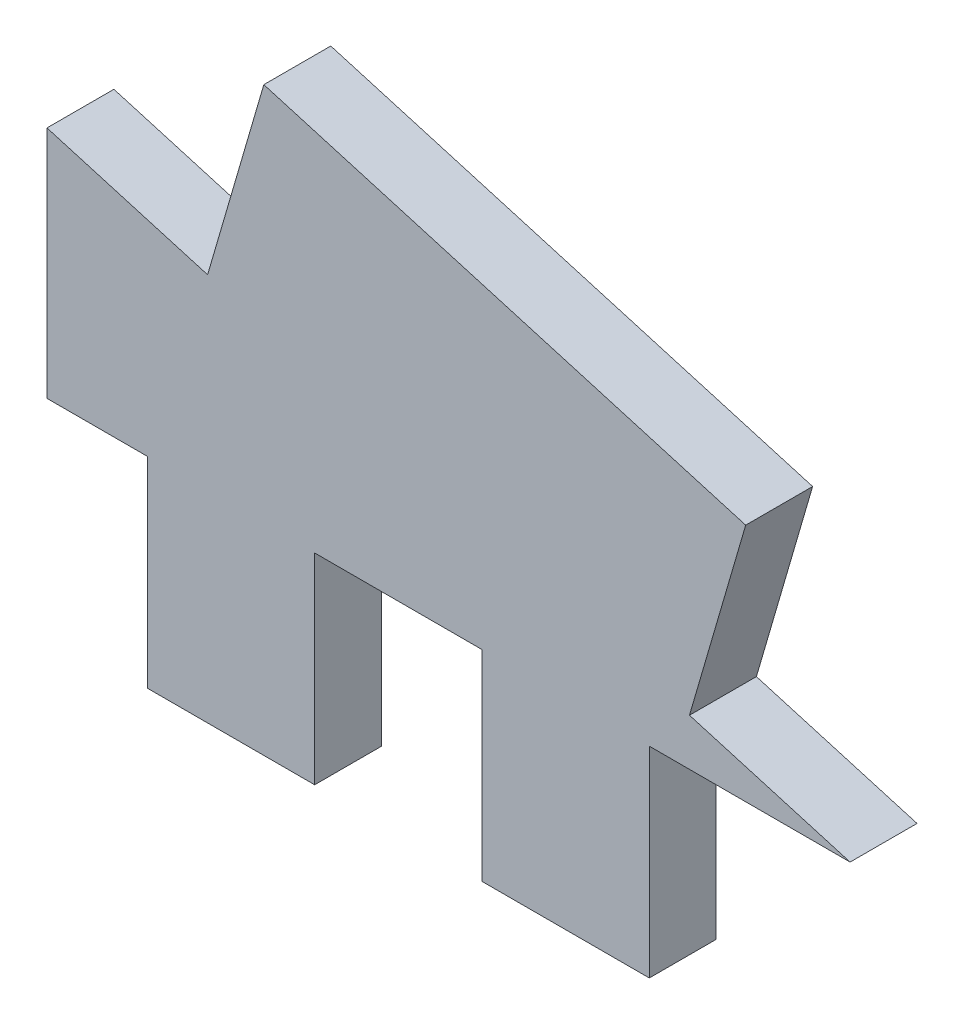
ISO-10303-21;
HEADER;
FILE_DESCRIPTION(('STEP AP214'),'2;1');
FILE_NAME('part.step','',(''),(''),'','','');
FILE_SCHEMA(('AUTOMOTIVE_DESIGN { 1 0 10303 214 1 1 1 1 }'));
ENDSEC;
DATA;
#1=APPLICATION_CONTEXT('core data for automotive mechanical design processes');
#2=APPLICATION_PROTOCOL_DEFINITION('international standard','automotive_design',2000,#1);
#3=PRODUCT_CONTEXT('',#1,'mechanical');
#4=PRODUCT('Part','Part','',(#3));
#5=PRODUCT_RELATED_PRODUCT_CATEGORY('part','',(#4));
#6=PRODUCT_DEFINITION_FORMATION('','',#4);
#7=PRODUCT_DEFINITION_CONTEXT('part definition',#1,'design');
#8=PRODUCT_DEFINITION('design','',#6,#7);
#9=PRODUCT_DEFINITION_SHAPE('','',#8);
#10=(LENGTH_UNIT() NAMED_UNIT(*) SI_UNIT(.MILLI.,.METRE.));
#11=(NAMED_UNIT(*) PLANE_ANGLE_UNIT() SI_UNIT($,.RADIAN.));
#12=(NAMED_UNIT(*) SI_UNIT($,.STERADIAN.) SOLID_ANGLE_UNIT());
#13=UNCERTAINTY_MEASURE_WITH_UNIT(LENGTH_MEASURE(1.E-05),#10,'distance_accuracy_value','');
#14=(GEOMETRIC_REPRESENTATION_CONTEXT(3) GLOBAL_UNCERTAINTY_ASSIGNED_CONTEXT((#13)) GLOBAL_UNIT_ASSIGNED_CONTEXT((#10,
#11,#12)) REPRESENTATION_CONTEXT('',''));
#15=CARTESIAN_POINT('',(0.,0.,0.));
#16=DIRECTION('',(0.,0.,1.));
#17=DIRECTION('',(1.,0.,0.));
#18=AXIS2_PLACEMENT_3D('',#15,#16,#17);
#19=CARTESIAN_POINT('',(1.8816,6.4512,2.));
#20=DIRECTION('',(-0.28,-0.96,0.));
#21=DIRECTION('',(0.96,-0.28,0.));
#22=AXIS2_PLACEMENT_3D('',#19,#20,#21);
#23=PLANE('',#22);
#24=DIRECTION('',(-0.96,0.28,0.));
#25=VECTOR('',#24,1.);
#26=CARTESIAN_POINT('',(1.8816,6.4512,0.));
#27=LINE('',#26,#25);
#28=CARTESIAN_POINT('',(24.,0.,0.));
#29=VERTEX_POINT('',#28);
#30=CARTESIAN_POINT('',(19.2,1.4,0.));
#31=VERTEX_POINT('',#30);
#32=EDGE_CURVE('E176',#29,#31,#27,.T.);
#33=ORIENTED_EDGE('',*,*,#32,.T.);
#34=DIRECTION('',(0.,0.,-1.));
#35=VECTOR('',#34,1.);
#36=CARTESIAN_POINT('',(19.2,1.4,2.));
#37=LINE('',#36,#35);
#38=CARTESIAN_POINT('',(19.2,1.4,2.));
#39=VERTEX_POINT('',#38);
#40=EDGE_CURVE('E11',#39,#31,#37,.T.);
#41=ORIENTED_EDGE('',*,*,#40,.F.);
#42=DIRECTION('',(-0.96,0.28,0.));
#43=VECTOR('',#42,1.);
#44=CARTESIAN_POINT('',(1.8816,6.4512,2.));
#45=LINE('',#44,#43);
#46=CARTESIAN_POINT('',(24.,0.,2.));
#47=VERTEX_POINT('',#46);
#48=EDGE_CURVE('E254',#47,#39,#45,.T.);
#49=ORIENTED_EDGE('',*,*,#48,.F.);
#50=DIRECTION('',(0.,0.,-1.));
#51=VECTOR('',#50,1.);
#52=CARTESIAN_POINT('',(24.,0.,2.));
#53=LINE('',#52,#51);
#54=EDGE_CURVE('E170',#47,#29,#53,.T.);
#55=ORIENTED_EDGE('',*,*,#54,.T.);
#56=EDGE_LOOP('',(#33,#41,#49,#55));
#57=FACE_BOUND('',#56,.T.);
#58=ADVANCED_FACE('F36',(#57),#23,.F.);
#59=CARTESIAN_POINT('',(17.3184,-5.05119999999999,2.));
#60=DIRECTION('',(-0.96,0.28,0.));
#61=DIRECTION('',(-0.28,-0.96,0.));
#62=AXIS2_PLACEMENT_3D('',#59,#60,#61);
#63=PLANE('',#62);
#64=DIRECTION('',(0.28,0.96,0.));
#65=VECTOR('',#64,1.);
#66=CARTESIAN_POINT('',(17.3184,-5.05119999999999,0.));
#67=LINE('',#66,#65);
#68=CARTESIAN_POINT('',(20.88,7.16,0.));
#69=VERTEX_POINT('',#68);
#70=EDGE_CURVE('E179',#31,#69,#67,.T.);
#71=ORIENTED_EDGE('',*,*,#70,.T.);
#72=DIRECTION('',(0.,0.,-1.));
#73=VECTOR('',#72,1.);
#74=CARTESIAN_POINT('',(20.88,7.16,2.));
#75=LINE('',#74,#73);
#76=CARTESIAN_POINT('',(20.88,7.16,2.));
#77=VERTEX_POINT('',#76);
#78=EDGE_CURVE('E45',#77,#69,#75,.T.);
#79=ORIENTED_EDGE('',*,*,#78,.F.);
#80=DIRECTION('',(0.28,0.96,0.));
#81=VECTOR('',#80,1.);
#82=CARTESIAN_POINT('',(17.3184,-5.05119999999999,2.));
#83=LINE('',#82,#81);
#84=EDGE_CURVE('E113',#39,#77,#83,.T.);
#85=ORIENTED_EDGE('',*,*,#84,.F.);
#86=ORIENTED_EDGE('',*,*,#40,.T.);
#87=EDGE_LOOP('',(#71,#79,#85,#86));
#88=FACE_BOUND('',#87,.T.);
#89=ADVANCED_FACE('F38',(#88),#63,.F.);
#90=CARTESIAN_POINT('',(3.5616,12.2112,2.));
#91=DIRECTION('',(0.28,0.96,0.));
#92=DIRECTION('',(-0.96,0.28,0.));
#93=AXIS2_PLACEMENT_3D('',#90,#91,#92);
#94=PLANE('',#93);
#95=DIRECTION('',(0.96,-0.28,0.));
#96=VECTOR('',#95,1.);
#97=CARTESIAN_POINT('',(3.5616,12.2112,0.));
#98=LINE('',#97,#96);
#99=CARTESIAN_POINT('',(6.48,11.36,0.));
#100=VERTEX_POINT('',#99);
#101=EDGE_CURVE('E183',#100,#69,#98,.T.);
#102=ORIENTED_EDGE('',*,*,#101,.F.);
#103=DIRECTION('',(0.,0.,-1.));
#104=VECTOR('',#103,1.);
#105=CARTESIAN_POINT('',(6.48,11.36,2.));
#106=LINE('',#105,#104);
#107=CARTESIAN_POINT('',(6.48,11.36,2.));
#108=VERTEX_POINT('',#107);
#109=EDGE_CURVE('E231',#108,#100,#106,.T.);
#110=ORIENTED_EDGE('',*,*,#109,.F.);
#111=DIRECTION('',(0.96,-0.28,0.));
#112=VECTOR('',#111,1.);
#113=CARTESIAN_POINT('',(3.5616,12.2112,2.));
#114=LINE('',#113,#112);
#115=EDGE_CURVE('E237',#108,#77,#114,.T.);
#116=ORIENTED_EDGE('',*,*,#115,.T.);
#117=ORIENTED_EDGE('',*,*,#78,.T.);
#118=EDGE_LOOP('',(#102,#110,#116,#117));
#119=FACE_BOUND('',#118,.T.);
#120=ADVANCED_FACE('F235',(#119),#94,.T.);
#121=CARTESIAN_POINT('',(2.9184,-0.8512,2.));
#122=DIRECTION('',(-0.96,0.28,0.));
#123=DIRECTION('',(-0.28,-0.96,0.));
#124=AXIS2_PLACEMENT_3D('',#121,#122,#123);
#125=PLANE('',#124);
#126=DIRECTION('',(0.28,0.96,0.));
#127=VECTOR('',#126,1.);
#128=CARTESIAN_POINT('',(2.9184,-0.8512,0.));
#129=LINE('',#128,#127);
#130=CARTESIAN_POINT('',(4.8,5.6,0.));
#131=VERTEX_POINT('',#130);
#132=EDGE_CURVE('E186',#131,#100,#129,.T.);
#133=ORIENTED_EDGE('',*,*,#132,.F.);
#134=DIRECTION('',(0.,0.,-1.));
#135=VECTOR('',#134,1.);
#136=CARTESIAN_POINT('',(4.8,5.6,2.));
#137=LINE('',#136,#135);
#138=CARTESIAN_POINT('',(4.8,5.6,2.));
#139=VERTEX_POINT('',#138);
#140=EDGE_CURVE('E229',#139,#131,#137,.T.);
#141=ORIENTED_EDGE('',*,*,#140,.F.);
#142=DIRECTION('',(0.28,0.96,0.));
#143=VECTOR('',#142,1.);
#144=CARTESIAN_POINT('',(2.9184,-0.8512,2.));
#145=LINE('',#144,#143);
#146=EDGE_CURVE('E250',#139,#108,#145,.T.);
#147=ORIENTED_EDGE('',*,*,#146,.T.);
#148=ORIENTED_EDGE('',*,*,#109,.T.);
#149=EDGE_LOOP('',(#133,#141,#147,#148));
#150=FACE_BOUND('',#149,.T.);
#151=ADVANCED_FACE('F246',(#150),#125,.T.);
#152=CARTESIAN_POINT('',(0.,7.,0.));
#153=VERTEX_POINT('',#152);
#154=EDGE_CURVE('E180',#131,#153,#27,.T.);
#155=ORIENTED_EDGE('',*,*,#154,.T.);
#156=DIRECTION('',(0.,0.,-1.));
#157=VECTOR('',#156,1.);
#158=CARTESIAN_POINT('',(0.,7.,2.));
#159=LINE('',#158,#157);
#160=CARTESIAN_POINT('',(0.,7.,2.));
#161=VERTEX_POINT('',#160);
#162=EDGE_CURVE('E226',#161,#153,#159,.T.);
#163=ORIENTED_EDGE('',*,*,#162,.F.);
#164=EDGE_CURVE('E252',#139,#161,#45,.T.);
#165=ORIENTED_EDGE('',*,*,#164,.F.);
#166=ORIENTED_EDGE('',*,*,#140,.T.);
#167=EDGE_LOOP('',(#155,#163,#165,#166));
#168=FACE_BOUND('',#167,.T.);
#169=ADVANCED_FACE('F280',(#168),#23,.F.);
#170=CARTESIAN_POINT('',(0.,0.,2.));
#171=DIRECTION('',(1.,0.,0.));
#172=DIRECTION('',(0.,1.,0.));
#173=AXIS2_PLACEMENT_3D('',#170,#171,#172);
#174=PLANE('',#173);
#175=DIRECTION('',(0.,-1.,0.));
#176=VECTOR('',#175,1.);
#177=CARTESIAN_POINT('',(0.,0.,0.));
#178=LINE('',#177,#176);
#179=CARTESIAN_POINT('',(0.,0.,0.));
#180=VERTEX_POINT('',#179);
#181=EDGE_CURVE('E189',#153,#180,#178,.T.);
#182=ORIENTED_EDGE('',*,*,#181,.T.);
#183=DIRECTION('',(0.,0.,-1.));
#184=VECTOR('',#183,1.);
#185=CARTESIAN_POINT('',(0.,0.,2.));
#186=LINE('',#185,#184);
#187=CARTESIAN_POINT('',(0.,0.,2.));
#188=VERTEX_POINT('',#187);
#189=EDGE_CURVE('E223',#188,#180,#186,.T.);
#190=ORIENTED_EDGE('',*,*,#189,.F.);
#191=DIRECTION('',(0.,-1.,0.));
#192=VECTOR('',#191,1.);
#193=CARTESIAN_POINT('',(0.,0.,2.));
#194=LINE('',#193,#192);
#195=EDGE_CURVE('E258',#161,#188,#194,.T.);
#196=ORIENTED_EDGE('',*,*,#195,.F.);
#197=ORIENTED_EDGE('',*,*,#162,.T.);
#198=EDGE_LOOP('',(#182,#190,#196,#197));
#199=FACE_BOUND('',#198,.T.);
#200=ADVANCED_FACE('F282',(#199),#174,.F.);
#201=CARTESIAN_POINT('',(0.,0.,2.));
#202=DIRECTION('',(0.,1.,0.));
#203=DIRECTION('',(0.,0.,1.));
#204=AXIS2_PLACEMENT_3D('',#201,#202,#203);
#205=PLANE('',#204);
#206=DIRECTION('',(1.,0.,0.));
#207=VECTOR('',#206,1.);
#208=CARTESIAN_POINT('',(0.,0.,0.));
#209=LINE('',#208,#207);
#210=CARTESIAN_POINT('',(3.,0.,0.));
#211=VERTEX_POINT('',#210);
#212=EDGE_CURVE('E191',#180,#211,#209,.T.);
#213=ORIENTED_EDGE('',*,*,#212,.T.);
#214=DIRECTION('',(0.,0.,-1.));
#215=VECTOR('',#214,1.);
#216=CARTESIAN_POINT('',(3.,0.,2.));
#217=LINE('',#216,#215);
#218=CARTESIAN_POINT('',(3.,0.,2.));
#219=VERTEX_POINT('',#218);
#220=EDGE_CURVE('E220',#219,#211,#217,.T.);
#221=ORIENTED_EDGE('',*,*,#220,.F.);
#222=DIRECTION('',(1.,0.,0.));
#223=VECTOR('',#222,1.);
#224=CARTESIAN_POINT('',(0.,0.,2.));
#225=LINE('',#224,#223);
#226=EDGE_CURVE('E173',#188,#219,#225,.T.);
#227=ORIENTED_EDGE('',*,*,#226,.F.);
#228=ORIENTED_EDGE('',*,*,#189,.T.);
#229=EDGE_LOOP('',(#213,#221,#227,#228));
#230=FACE_BOUND('',#229,.T.);
#231=ADVANCED_FACE('F287',(#230),#205,.F.);
#232=CARTESIAN_POINT('',(3.,0.,2.));
#233=DIRECTION('',(1.,0.,0.));
#234=DIRECTION('',(0.,1.,0.));
#235=AXIS2_PLACEMENT_3D('',#232,#233,#234);
#236=PLANE('',#235);
#237=DIRECTION('',(0.,-1.,0.));
#238=VECTOR('',#237,1.);
#239=CARTESIAN_POINT('',(3.,0.,0.));
#240=LINE('',#239,#238);
#241=CARTESIAN_POINT('',(3.,-6.,0.));
#242=VERTEX_POINT('',#241);
#243=EDGE_CURVE('E193',#211,#242,#240,.T.);
#244=ORIENTED_EDGE('',*,*,#243,.T.);
#245=DIRECTION('',(0.,0.,-1.));
#246=VECTOR('',#245,1.);
#247=CARTESIAN_POINT('',(3.,-6.,2.));
#248=LINE('',#247,#246);
#249=CARTESIAN_POINT('',(3.,-6.,2.));
#250=VERTEX_POINT('',#249);
#251=EDGE_CURVE('E217',#250,#242,#248,.T.);
#252=ORIENTED_EDGE('',*,*,#251,.F.);
#253=DIRECTION('',(0.,-1.,0.));
#254=VECTOR('',#253,1.);
#255=CARTESIAN_POINT('',(3.,0.,2.));
#256=LINE('',#255,#254);
#257=EDGE_CURVE('E260',#219,#250,#256,.T.);
#258=ORIENTED_EDGE('',*,*,#257,.F.);
#259=ORIENTED_EDGE('',*,*,#220,.T.);
#260=EDGE_LOOP('',(#244,#252,#258,#259));
#261=FACE_BOUND('',#260,.T.);
#262=ADVANCED_FACE('F293',(#261),#236,.F.);
#263=CARTESIAN_POINT('',(0.,-6.,2.));
#264=DIRECTION('',(0.,1.,0.));
#265=DIRECTION('',(0.,0.,1.));
#266=AXIS2_PLACEMENT_3D('',#263,#264,#265);
#267=PLANE('',#266);
#268=DIRECTION('',(1.,0.,0.));
#269=VECTOR('',#268,1.);
#270=CARTESIAN_POINT('',(0.,-6.,0.));
#271=LINE('',#270,#269);
#272=CARTESIAN_POINT('',(8.,-6.,0.));
#273=VERTEX_POINT('',#272);
#274=EDGE_CURVE('E196',#242,#273,#271,.T.);
#275=ORIENTED_EDGE('',*,*,#274,.T.);
#276=DIRECTION('',(0.,0.,-1.));
#277=VECTOR('',#276,1.);
#278=CARTESIAN_POINT('',(8.,-6.,2.));
#279=LINE('',#278,#277);
#280=CARTESIAN_POINT('',(8.,-6.,2.));
#281=VERTEX_POINT('',#280);
#282=EDGE_CURVE('E215',#281,#273,#279,.T.);
#283=ORIENTED_EDGE('',*,*,#282,.F.);
#284=DIRECTION('',(1.,0.,0.));
#285=VECTOR('',#284,1.);
#286=CARTESIAN_POINT('',(0.,-6.,2.));
#287=LINE('',#286,#285);
#288=EDGE_CURVE('E262',#250,#281,#287,.T.);
#289=ORIENTED_EDGE('',*,*,#288,.F.);
#290=ORIENTED_EDGE('',*,*,#251,.T.);
#291=EDGE_LOOP('',(#275,#283,#289,#290));
#292=FACE_BOUND('',#291,.T.);
#293=ADVANCED_FACE('F297',(#292),#267,.F.);
#294=CARTESIAN_POINT('',(8.,0.,2.));
#295=DIRECTION('',(1.,0.,0.));
#296=DIRECTION('',(0.,0.,-1.));
#297=AXIS2_PLACEMENT_3D('',#294,#295,#296);
#298=PLANE('',#297);
#299=DIRECTION('',(0.,-1.,0.));
#300=VECTOR('',#299,1.);
#301=CARTESIAN_POINT('',(8.,0.,0.));
#302=LINE('',#301,#300);
#303=CARTESIAN_POINT('',(8.,0.,0.));
#304=VERTEX_POINT('',#303);
#305=EDGE_CURVE('E199',#304,#273,#302,.T.);
#306=ORIENTED_EDGE('',*,*,#305,.F.);
#307=DIRECTION('',(0.,0.,-1.));
#308=VECTOR('',#307,1.);
#309=CARTESIAN_POINT('',(8.,0.,2.));
#310=LINE('',#309,#308);
#311=CARTESIAN_POINT('',(8.,0.,2.));
#312=VERTEX_POINT('',#311);
#313=EDGE_CURVE('E213',#312,#304,#310,.T.);
#314=ORIENTED_EDGE('',*,*,#313,.F.);
#315=DIRECTION('',(0.,-1.,0.));
#316=VECTOR('',#315,1.);
#317=CARTESIAN_POINT('',(8.,0.,2.));
#318=LINE('',#317,#316);
#319=EDGE_CURVE('E264',#312,#281,#318,.T.);
#320=ORIENTED_EDGE('',*,*,#319,.T.);
#321=ORIENTED_EDGE('',*,*,#282,.T.);
#322=EDGE_LOOP('',(#306,#314,#320,#321));
#323=FACE_BOUND('',#322,.T.);
#324=ADVANCED_FACE('F300',(#323),#298,.T.);
#325=CARTESIAN_POINT('',(13.,0.,0.));
#326=VERTEX_POINT('',#325);
#327=EDGE_CURVE('E194',#304,#326,#209,.T.);
#328=ORIENTED_EDGE('',*,*,#327,.T.);
#329=DIRECTION('',(0.,0.,-1.));
#330=VECTOR('',#329,1.);
#331=CARTESIAN_POINT('',(13.,0.,2.));
#332=LINE('',#331,#330);
#333=CARTESIAN_POINT('',(13.,0.,2.));
#334=VERTEX_POINT('',#333);
#335=EDGE_CURVE('E210',#334,#326,#332,.T.);
#336=ORIENTED_EDGE('',*,*,#335,.F.);
#337=EDGE_CURVE('E172',#312,#334,#225,.T.);
#338=ORIENTED_EDGE('',*,*,#337,.F.);
#339=ORIENTED_EDGE('',*,*,#313,.T.);
#340=EDGE_LOOP('',(#328,#336,#338,#339));
#341=FACE_BOUND('',#340,.T.);
#342=ADVANCED_FACE('F270',(#341),#205,.F.);
#343=CARTESIAN_POINT('',(13.,0.,2.));
#344=DIRECTION('',(1.,0.,0.));
#345=DIRECTION('',(0.,0.,-1.));
#346=AXIS2_PLACEMENT_3D('',#343,#344,#345);
#347=PLANE('',#346);
#348=DIRECTION('',(0.,-1.,0.));
#349=VECTOR('',#348,1.);
#350=CARTESIAN_POINT('',(13.,0.,0.));
#351=LINE('',#350,#349);
#352=CARTESIAN_POINT('',(13.,-6.,0.));
#353=VERTEX_POINT('',#352);
#354=EDGE_CURVE('E202',#326,#353,#351,.T.);
#355=ORIENTED_EDGE('',*,*,#354,.T.);
#356=DIRECTION('',(0.,0.,-1.));
#357=VECTOR('',#356,1.);
#358=CARTESIAN_POINT('',(13.,-6.,2.));
#359=LINE('',#358,#357);
#360=CARTESIAN_POINT('',(13.,-6.,2.));
#361=VERTEX_POINT('',#360);
#362=EDGE_CURVE('E166',#361,#353,#359,.T.);
#363=ORIENTED_EDGE('',*,*,#362,.F.);
#364=DIRECTION('',(0.,-1.,0.));
#365=VECTOR('',#364,1.);
#366=CARTESIAN_POINT('',(13.,0.,2.));
#367=LINE('',#366,#365);
#368=EDGE_CURVE('E153',#334,#361,#367,.T.);
#369=ORIENTED_EDGE('',*,*,#368,.F.);
#370=ORIENTED_EDGE('',*,*,#335,.T.);
#371=EDGE_LOOP('',(#355,#363,#369,#370));
#372=FACE_BOUND('',#371,.T.);
#373=ADVANCED_FACE('F274',(#372),#347,.F.);
#374=CARTESIAN_POINT('',(0.,-6.,2.));
#375=DIRECTION('',(0.,1.,0.));
#376=DIRECTION('',(0.,0.,1.));
#377=AXIS2_PLACEMENT_3D('',#374,#375,#376);
#378=PLANE('',#377);
#379=DIRECTION('',(1.,0.,0.));
#380=VECTOR('',#379,1.);
#381=CARTESIAN_POINT('',(0.,-6.,0.));
#382=LINE('',#381,#380);
#383=CARTESIAN_POINT('',(18.,-6.,0.));
#384=VERTEX_POINT('',#383);
#385=EDGE_CURVE('E162',#353,#384,#382,.T.);
#386=ORIENTED_EDGE('',*,*,#385,.T.);
#387=DIRECTION('',(0.,0.,-1.));
#388=VECTOR('',#387,1.);
#389=CARTESIAN_POINT('',(18.,-6.,2.));
#390=LINE('',#389,#388);
#391=CARTESIAN_POINT('',(18.,-6.,2.));
#392=VERTEX_POINT('',#391);
#393=EDGE_CURVE('E159',#392,#384,#390,.T.);
#394=ORIENTED_EDGE('',*,*,#393,.F.);
#395=DIRECTION('',(1.,0.,0.));
#396=VECTOR('',#395,1.);
#397=CARTESIAN_POINT('',(0.,-6.,2.));
#398=LINE('',#397,#396);
#399=EDGE_CURVE('E147',#361,#392,#398,.T.);
#400=ORIENTED_EDGE('',*,*,#399,.F.);
#401=ORIENTED_EDGE('',*,*,#362,.T.);
#402=EDGE_LOOP('',(#386,#394,#400,#401));
#403=FACE_BOUND('',#402,.T.);
#404=ADVANCED_FACE('F160',(#403),#378,.F.);
#405=CARTESIAN_POINT('',(18.,0.,2.));
#406=DIRECTION('',(1.,0.,0.));
#407=DIRECTION('',(0.,0.,-1.));
#408=AXIS2_PLACEMENT_3D('',#405,#406,#407);
#409=PLANE('',#408);
#410=DIRECTION('',(0.,-1.,0.));
#411=VECTOR('',#410,1.);
#412=CARTESIAN_POINT('',(18.,0.,0.));
#413=LINE('',#412,#411);
#414=CARTESIAN_POINT('',(18.,0.,0.));
#415=VERTEX_POINT('',#414);
#416=EDGE_CURVE('E205',#415,#384,#413,.T.);
#417=ORIENTED_EDGE('',*,*,#416,.F.);
#418=DIRECTION('',(0.,0.,-1.));
#419=VECTOR('',#418,1.);
#420=CARTESIAN_POINT('',(18.,0.,2.));
#421=LINE('',#420,#419);
#422=CARTESIAN_POINT('',(18.,0.,2.));
#423=VERTEX_POINT('',#422);
#424=EDGE_CURVE('E102',#423,#415,#421,.T.);
#425=ORIENTED_EDGE('',*,*,#424,.F.);
#426=DIRECTION('',(0.,-1.,0.));
#427=VECTOR('',#426,1.);
#428=CARTESIAN_POINT('',(18.,0.,2.));
#429=LINE('',#428,#427);
#430=EDGE_CURVE('E151',#423,#392,#429,.T.);
#431=ORIENTED_EDGE('',*,*,#430,.T.);
#432=ORIENTED_EDGE('',*,*,#393,.T.);
#433=EDGE_LOOP('',(#417,#425,#431,#432));
#434=FACE_BOUND('',#433,.T.);
#435=ADVANCED_FACE('F168',(#434),#409,.T.);
#436=EDGE_CURVE('E105',#415,#29,#209,.T.);
#437=ORIENTED_EDGE('',*,*,#436,.T.);
#438=ORIENTED_EDGE('',*,*,#54,.F.);
#439=EDGE_CURVE('E53',#423,#47,#225,.T.);
#440=ORIENTED_EDGE('',*,*,#439,.F.);
#441=ORIENTED_EDGE('',*,*,#424,.T.);
#442=EDGE_LOOP('',(#437,#438,#440,#441));
#443=FACE_BOUND('',#442,.T.);
#444=ADVANCED_FACE('F308',(#443),#205,.F.);
#445=CARTESIAN_POINT('',(0.,0.,2.));
#446=DIRECTION('',(0.,0.,1.));
#447=DIRECTION('',(1.,0.,0.));
#448=AXIS2_PLACEMENT_3D('',#445,#446,#447);
#449=PLANE('',#448);
#450=ORIENTED_EDGE('',*,*,#48,.T.);
#451=ORIENTED_EDGE('',*,*,#84,.T.);
#452=ORIENTED_EDGE('',*,*,#115,.F.);
#453=ORIENTED_EDGE('',*,*,#146,.F.);
#454=ORIENTED_EDGE('',*,*,#164,.T.);
#455=ORIENTED_EDGE('',*,*,#195,.T.);
#456=ORIENTED_EDGE('',*,*,#226,.T.);
#457=ORIENTED_EDGE('',*,*,#257,.T.);
#458=ORIENTED_EDGE('',*,*,#288,.T.);
#459=ORIENTED_EDGE('',*,*,#319,.F.);
#460=ORIENTED_EDGE('',*,*,#337,.T.);
#461=ORIENTED_EDGE('',*,*,#368,.T.);
#462=ORIENTED_EDGE('',*,*,#399,.T.);
#463=ORIENTED_EDGE('',*,*,#430,.F.);
#464=ORIENTED_EDGE('',*,*,#439,.T.);
#465=EDGE_LOOP('',(#450,#451,#452,#453,#454,#455,#456,#457,#458,#459,#460,#461,#462,#463,#464));
#466=FACE_BOUND('',#465,.T.);
#467=ADVANCED_FACE('F149',(#466),#449,.T.);
#468=CARTESIAN_POINT('',(0.,0.,0.));
#469=DIRECTION('',(0.,0.,1.));
#470=DIRECTION('',(1.,0.,0.));
#471=AXIS2_PLACEMENT_3D('',#468,#469,#470);
#472=PLANE('',#471);
#473=ORIENTED_EDGE('',*,*,#32,.F.);
#474=ORIENTED_EDGE('',*,*,#436,.F.);
#475=ORIENTED_EDGE('',*,*,#416,.T.);
#476=ORIENTED_EDGE('',*,*,#385,.F.);
#477=ORIENTED_EDGE('',*,*,#354,.F.);
#478=ORIENTED_EDGE('',*,*,#327,.F.);
#479=ORIENTED_EDGE('',*,*,#305,.T.);
#480=ORIENTED_EDGE('',*,*,#274,.F.);
#481=ORIENTED_EDGE('',*,*,#243,.F.);
#482=ORIENTED_EDGE('',*,*,#212,.F.);
#483=ORIENTED_EDGE('',*,*,#181,.F.);
#484=ORIENTED_EDGE('',*,*,#154,.F.);
#485=ORIENTED_EDGE('',*,*,#132,.T.);
#486=ORIENTED_EDGE('',*,*,#101,.T.);
#487=ORIENTED_EDGE('',*,*,#70,.F.);
#488=EDGE_LOOP('',(#473,#474,#475,#476,#477,#478,#479,#480,#481,#482,#483,#484,#485,#486,#487));
#489=FACE_BOUND('',#488,.T.);
#490=ADVANCED_FACE('F241',(#489),#472,.F.);
#491=CLOSED_SHELL('',(#58,#89,#120,#151,#169,#200,#231,#262,#293,#324,#342,#373,#404,#435,#444,
#467,#490));
#492=MANIFOLD_SOLID_BREP('B2',#491);
#493=ADVANCED_BREP_SHAPE_REPRESENTATION('',(#18,#492),#14);
#494=SHAPE_DEFINITION_REPRESENTATION(#9,#493);
ENDSEC;
END-ISO-10303-21;
